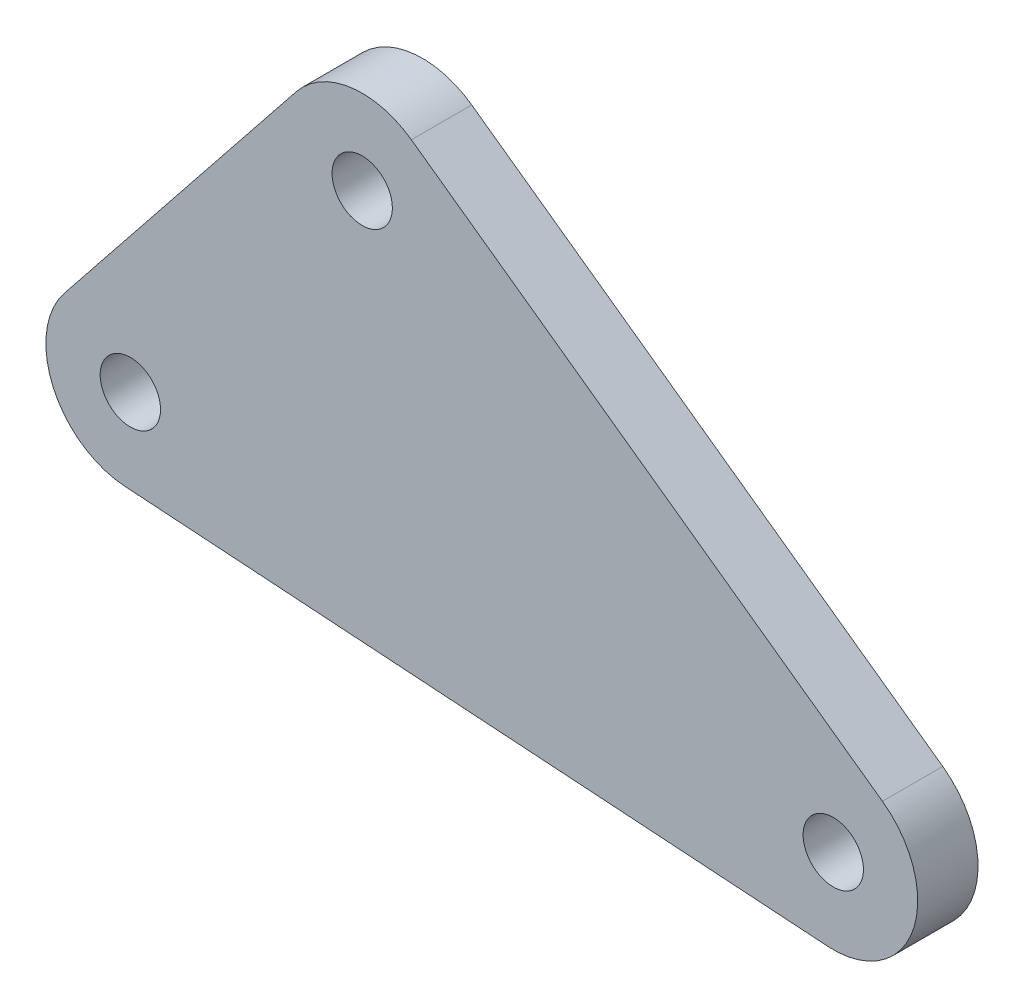
ISO-10303-21;
HEADER;
FILE_DESCRIPTION(('STEP AP214'),'2;1');
FILE_NAME('part.step','',(''),(''),'','','');
FILE_SCHEMA(('AUTOMOTIVE_DESIGN { 1 0 10303 214 1 1 1 1 }'));
ENDSEC;
DATA;
#1=APPLICATION_CONTEXT('core data for automotive mechanical design processes');
#2=APPLICATION_PROTOCOL_DEFINITION('international standard','automotive_design',2000,#1);
#3=PRODUCT_CONTEXT('',#1,'mechanical');
#4=PRODUCT('Part','Part','',(#3));
#5=PRODUCT_RELATED_PRODUCT_CATEGORY('part','',(#4));
#6=PRODUCT_DEFINITION_FORMATION('','',#4);
#7=PRODUCT_DEFINITION_CONTEXT('part definition',#1,'design');
#8=PRODUCT_DEFINITION('design','',#6,#7);
#9=PRODUCT_DEFINITION_SHAPE('','',#8);
#10=(LENGTH_UNIT() NAMED_UNIT(*) SI_UNIT(.MILLI.,.METRE.));
#11=(NAMED_UNIT(*) PLANE_ANGLE_UNIT() SI_UNIT($,.RADIAN.));
#12=(NAMED_UNIT(*) SI_UNIT($,.STERADIAN.) SOLID_ANGLE_UNIT());
#13=UNCERTAINTY_MEASURE_WITH_UNIT(LENGTH_MEASURE(1.E-05),#10,'distance_accuracy_value','');
#14=(GEOMETRIC_REPRESENTATION_CONTEXT(3) GLOBAL_UNCERTAINTY_ASSIGNED_CONTEXT((#13)) GLOBAL_UNIT_ASSIGNED_CONTEXT((#10,
#11,#12)) REPRESENTATION_CONTEXT('',''));
#15=CARTESIAN_POINT('',(0.,0.,0.));
#16=DIRECTION('',(0.,0.,1.));
#17=DIRECTION('',(1.,0.,0.));
#18=AXIS2_PLACEMENT_3D('',#15,#16,#17);
#19=CARTESIAN_POINT('',(0.,0.,6.35));
#20=DIRECTION('',(0.,0.,-1.));
#21=DIRECTION('',(-1.,0.,0.));
#22=AXIS2_PLACEMENT_3D('',#19,#20,#21);
#23=PLANE('',#22);
#24=DIRECTION('',(0.997779520334436,-0.0666035194354014,0.));
#25=VECTOR('',#24,1.);
#26=CARTESIAN_POINT('',(104.54447737393,-15.8883097994683,6.35));
#27=LINE('',#26,#25);
#28=CARTESIAN_POINT('',(-0.592105287780698,-8.87025993577314,6.35));
#29=VERTEX_POINT('',#28);
#30=CARTESIAN_POINT('',(73.3942439245381,-13.8089775054276,6.35));
#31=VERTEX_POINT('',#30);
#32=EDGE_CURVE('E124',#29,#31,#27,.T.);
#33=ORIENTED_EDGE('',*,*,#32,.T.);
#34=CARTESIAN_POINT('',(73.9863492123188,-4.93871756965445,6.35));
#35=DIRECTION('',(0.,0.,-1.));
#36=DIRECTION('',(-1.,0.,0.));
#37=AXIS2_PLACEMENT_3D('',#34,#35,#36);
#38=CIRCLE('',#37,8.89);
#39=CARTESIAN_POINT('',(79.1624719991504,2.28899665378038,6.35));
#40=VERTEX_POINT('',#39);
#41=EDGE_CURVE('E136',#31,#40,#38,.F.);
#42=ORIENTED_EDGE('',*,*,#41,.T.);
#43=DIRECTION('',(-0.813016223108531,0.582241033389385,0.));
#44=VECTOR('',#43,1.);
#45=CARTESIAN_POINT('',(22.7210333975556,42.7094957819869,6.35));
#46=LINE('',#45,#44);
#47=CARTESIAN_POINT('',(29.5806776328767,37.7969660750321,6.35));
#48=VERTEX_POINT('',#47);
#49=EDGE_CURVE('E113',#40,#48,#46,.T.);
#50=ORIENTED_EDGE('',*,*,#49,.T.);
#51=CARTESIAN_POINT('',(24.404554846045,30.5692518515972,6.35));
#52=DIRECTION('',(0.,0.,-1.));
#53=DIRECTION('',(-1.,0.,0.));
#54=AXIS2_PLACEMENT_3D('',#51,#52,#53);
#55=CIRCLE('',#54,8.89);
#56=CARTESIAN_POINT('',(17.4569976070457,36.1157415893347,6.35));
#57=VERTEX_POINT('',#56);
#58=EDGE_CURVE('E62',#48,#57,#55,.F.);
#59=ORIENTED_EDGE('',*,*,#58,.T.);
#60=DIRECTION('',(-0.623902107732003,-0.781502501574732,0.));
#61=VECTOR('',#60,1.);
#62=CARTESIAN_POINT('',(-17.5531186725038,-7.73808277479587,6.35));
#63=LINE('',#62,#61);
#64=CARTESIAN_POINT('',(-6.94755723899937,5.54648973773751,6.35));
#65=VERTEX_POINT('',#64);
#66=EDGE_CURVE('E126',#57,#65,#63,.T.);
#67=ORIENTED_EDGE('',*,*,#66,.T.);
#68=CARTESIAN_POINT('',(0.,0.,6.35));
#69=DIRECTION('',(0.,0.,-1.));
#70=DIRECTION('',(-1.,0.,0.));
#71=AXIS2_PLACEMENT_3D('',#68,#69,#70);
#72=CIRCLE('',#71,8.89);
#73=EDGE_CURVE('E140',#65,#29,#72,.F.);
#74=ORIENTED_EDGE('',*,*,#73,.T.);
#75=EDGE_LOOP('',(#33,#42,#50,#59,#67,#74));
#76=FACE_BOUND('',#75,.T.);
#77=CARTESIAN_POINT('',(24.404554846045,30.5692518515972,6.35));
#78=DIRECTION('',(0.,0.,1.));
#79=DIRECTION('',(1.,0.,0.));
#80=AXIS2_PLACEMENT_3D('',#77,#78,#79);
#81=CIRCLE('',#80,3.175);
#82=CARTESIAN_POINT('',(27.579554846045,30.5692518515972,6.35));
#83=VERTEX_POINT('',#82);
#84=EDGE_CURVE('E123',#83,#83,#81,.T.);
#85=ORIENTED_EDGE('',*,*,#84,.F.);
#86=EDGE_LOOP('',(#85));
#87=FACE_BOUND('',#86,.T.);
#88=CARTESIAN_POINT('',(0.,0.,6.35));
#89=DIRECTION('',(0.,0.,1.));
#90=DIRECTION('',(1.,0.,0.));
#91=AXIS2_PLACEMENT_3D('',#88,#89,#90);
#92=CIRCLE('',#91,3.175);
#93=CARTESIAN_POINT('',(3.175,0.,6.35));
#94=VERTEX_POINT('',#93);
#95=EDGE_CURVE('E168',#94,#94,#92,.T.);
#96=ORIENTED_EDGE('',*,*,#95,.F.);
#97=EDGE_LOOP('',(#96));
#98=FACE_BOUND('',#97,.T.);
#99=CARTESIAN_POINT('',(73.9863492123188,-4.93871756965445,6.35));
#100=DIRECTION('',(0.,0.,1.));
#101=DIRECTION('',(1.,0.,0.));
#102=AXIS2_PLACEMENT_3D('',#99,#100,#101);
#103=CIRCLE('',#102,3.17499999999997);
#104=CARTESIAN_POINT('',(77.1613492123188,-4.93871756965445,6.35));
#105=VERTEX_POINT('',#104);
#106=EDGE_CURVE('E169',#105,#105,#103,.T.);
#107=ORIENTED_EDGE('',*,*,#106,.F.);
#108=EDGE_LOOP('',(#107));
#109=FACE_BOUND('',#108,.T.);
#110=ADVANCED_FACE('F41',(#76,#87,#98,#109),#23,.F.);
#111=CARTESIAN_POINT('',(0.,0.,0.));
#112=DIRECTION('',(0.,0.,-1.));
#113=DIRECTION('',(-1.,0.,0.));
#114=AXIS2_PLACEMENT_3D('',#111,#112,#113);
#115=PLANE('',#114);
#116=CARTESIAN_POINT('',(0.,0.,0.));
#117=DIRECTION('',(0.,0.,1.));
#118=DIRECTION('',(1.,0.,0.));
#119=AXIS2_PLACEMENT_3D('',#116,#117,#118);
#120=CIRCLE('',#119,3.175);
#121=CARTESIAN_POINT('',(3.175,0.,0.));
#122=VERTEX_POINT('',#121);
#123=EDGE_CURVE('E171',#122,#122,#120,.T.);
#124=ORIENTED_EDGE('',*,*,#123,.T.);
#125=EDGE_LOOP('',(#124));
#126=FACE_BOUND('',#125,.T.);
#127=DIRECTION('',(-0.813016223108531,0.582241033389385,0.));
#128=VECTOR('',#127,1.);
#129=CARTESIAN_POINT('',(22.7210333975556,42.7094957819869,0.));
#130=LINE('',#129,#128);
#131=CARTESIAN_POINT('',(79.1624719991504,2.28899665378038,0.));
#132=VERTEX_POINT('',#131);
#133=CARTESIAN_POINT('',(29.5806776328767,37.7969660750321,0.));
#134=VERTEX_POINT('',#133);
#135=EDGE_CURVE('E111',#132,#134,#130,.T.);
#136=ORIENTED_EDGE('',*,*,#135,.F.);
#137=CARTESIAN_POINT('',(73.9863492123188,-4.93871756965445,0.));
#138=DIRECTION('',(0.,0.,-1.));
#139=DIRECTION('',(-1.,0.,0.));
#140=AXIS2_PLACEMENT_3D('',#137,#138,#139);
#141=CIRCLE('',#140,8.89);
#142=CARTESIAN_POINT('',(73.3942439245381,-13.8089775054276,0.));
#143=VERTEX_POINT('',#142);
#144=EDGE_CURVE('E91',#132,#143,#141,.T.);
#145=ORIENTED_EDGE('',*,*,#144,.T.);
#146=DIRECTION('',(0.997779520334436,-0.0666035194354014,0.));
#147=VECTOR('',#146,1.);
#148=CARTESIAN_POINT('',(104.54447737393,-15.8883097994683,0.));
#149=LINE('',#148,#147);
#150=CARTESIAN_POINT('',(-0.592105287780698,-8.87025993577314,0.));
#151=VERTEX_POINT('',#150);
#152=EDGE_CURVE('E122',#151,#143,#149,.T.);
#153=ORIENTED_EDGE('',*,*,#152,.F.);
#154=CARTESIAN_POINT('',(0.,0.,0.));
#155=DIRECTION('',(0.,0.,-1.));
#156=DIRECTION('',(-1.,0.,0.));
#157=AXIS2_PLACEMENT_3D('',#154,#155,#156);
#158=CIRCLE('',#157,8.89);
#159=CARTESIAN_POINT('',(-6.94755723899937,5.54648973773751,0.));
#160=VERTEX_POINT('',#159);
#161=EDGE_CURVE('E102',#151,#160,#158,.T.);
#162=ORIENTED_EDGE('',*,*,#161,.T.);
#163=DIRECTION('',(-0.623902107732003,-0.781502501574732,0.));
#164=VECTOR('',#163,1.);
#165=CARTESIAN_POINT('',(-17.5531186725038,-7.73808277479587,0.));
#166=LINE('',#165,#164);
#167=CARTESIAN_POINT('',(17.4569976070457,36.1157415893347,0.));
#168=VERTEX_POINT('',#167);
#169=EDGE_CURVE('E119',#168,#160,#166,.T.);
#170=ORIENTED_EDGE('',*,*,#169,.F.);
#171=CARTESIAN_POINT('',(24.404554846045,30.5692518515972,0.));
#172=DIRECTION('',(0.,0.,-1.));
#173=DIRECTION('',(-1.,0.,0.));
#174=AXIS2_PLACEMENT_3D('',#171,#172,#173);
#175=CIRCLE('',#174,8.89);
#176=EDGE_CURVE('E112',#168,#134,#175,.T.);
#177=ORIENTED_EDGE('',*,*,#176,.T.);
#178=EDGE_LOOP('',(#136,#145,#153,#162,#170,#177));
#179=FACE_BOUND('',#178,.T.);
#180=CARTESIAN_POINT('',(24.404554846045,30.5692518515972,0.));
#181=DIRECTION('',(0.,0.,1.));
#182=DIRECTION('',(1.,0.,0.));
#183=AXIS2_PLACEMENT_3D('',#180,#181,#182);
#184=CIRCLE('',#183,3.175);
#185=CARTESIAN_POINT('',(27.579554846045,30.5692518515972,0.));
#186=VERTEX_POINT('',#185);
#187=EDGE_CURVE('E151',#186,#186,#184,.T.);
#188=ORIENTED_EDGE('',*,*,#187,.T.);
#189=EDGE_LOOP('',(#188));
#190=FACE_BOUND('',#189,.T.);
#191=CARTESIAN_POINT('',(73.9863492123188,-4.93871756965445,0.));
#192=DIRECTION('',(0.,0.,1.));
#193=DIRECTION('',(1.,0.,0.));
#194=AXIS2_PLACEMENT_3D('',#191,#192,#193);
#195=CIRCLE('',#194,3.17499999999997);
#196=CARTESIAN_POINT('',(77.1613492123188,-4.93871756965445,0.));
#197=VERTEX_POINT('',#196);
#198=EDGE_CURVE('E175',#197,#197,#195,.T.);
#199=ORIENTED_EDGE('',*,*,#198,.T.);
#200=EDGE_LOOP('',(#199));
#201=FACE_BOUND('',#200,.T.);
#202=ADVANCED_FACE('F120',(#126,#179,#190,#201),#115,.T.);
#203=CARTESIAN_POINT('',(104.54447737393,-15.8883097994683,6.35));
#204=DIRECTION('',(0.0666035194354014,0.997779520334436,0.));
#205=DIRECTION('',(-0.997779520334437,0.0666035194354014,0.));
#206=AXIS2_PLACEMENT_3D('',#203,#204,#205);
#207=PLANE('',#206);
#208=ORIENTED_EDGE('',*,*,#152,.T.);
#209=DIRECTION('',(0.,0.,-1.));
#210=VECTOR('',#209,1.);
#211=CARTESIAN_POINT('',(73.3942439245381,-13.8089775054276,6.35));
#212=LINE('',#211,#210);
#213=EDGE_CURVE('E100',#143,#31,#212,.F.);
#214=ORIENTED_EDGE('',*,*,#213,.T.);
#215=ORIENTED_EDGE('',*,*,#32,.F.);
#216=DIRECTION('',(0.,0.,-1.));
#217=VECTOR('',#216,1.);
#218=CARTESIAN_POINT('',(-0.592105287780711,-8.87025993577314,6.35));
#219=LINE('',#218,#217);
#220=EDGE_CURVE('E104',#29,#151,#219,.T.);
#221=ORIENTED_EDGE('',*,*,#220,.T.);
#222=EDGE_LOOP('',(#208,#214,#215,#221));
#223=FACE_BOUND('',#222,.T.);
#224=ADVANCED_FACE('F148',(#223),#207,.F.);
#225=CARTESIAN_POINT('',(22.7210333975556,42.7094957819869,6.35));
#226=DIRECTION('',(-0.582241033389385,-0.813016223108531,0.));
#227=DIRECTION('',(0.813016223108531,-0.582241033389385,0.));
#228=AXIS2_PLACEMENT_3D('',#225,#226,#227);
#229=PLANE('',#228);
#230=ORIENTED_EDGE('',*,*,#49,.F.);
#231=DIRECTION('',(0.,0.,-1.));
#232=VECTOR('',#231,1.);
#233=CARTESIAN_POINT('',(79.1624719991504,2.28899665378038,6.35));
#234=LINE('',#233,#232);
#235=EDGE_CURVE('E96',#40,#132,#234,.T.);
#236=ORIENTED_EDGE('',*,*,#235,.T.);
#237=ORIENTED_EDGE('',*,*,#135,.T.);
#238=DIRECTION('',(0.,0.,-1.));
#239=VECTOR('',#238,1.);
#240=CARTESIAN_POINT('',(29.5806776328767,37.7969660750321,6.35));
#241=LINE('',#240,#239);
#242=EDGE_CURVE('E114',#134,#48,#241,.F.);
#243=ORIENTED_EDGE('',*,*,#242,.T.);
#244=EDGE_LOOP('',(#230,#236,#237,#243));
#245=FACE_BOUND('',#244,.T.);
#246=ADVANCED_FACE('F109',(#245),#229,.F.);
#247=CARTESIAN_POINT('',(-17.5531186725038,-7.73808277479587,6.35));
#248=DIRECTION('',(0.781502501574732,-0.623902107732003,0.));
#249=DIRECTION('',(0.623902107732003,0.781502501574732,0.));
#250=AXIS2_PLACEMENT_3D('',#247,#248,#249);
#251=PLANE('',#250);
#252=ORIENTED_EDGE('',*,*,#169,.T.);
#253=DIRECTION('',(0.,0.,-1.));
#254=VECTOR('',#253,1.);
#255=CARTESIAN_POINT('',(-6.94755723899937,5.54648973773751,6.35));
#256=LINE('',#255,#254);
#257=EDGE_CURVE('E11',#160,#65,#256,.F.);
#258=ORIENTED_EDGE('',*,*,#257,.T.);
#259=ORIENTED_EDGE('',*,*,#66,.F.);
#260=DIRECTION('',(0.,0.,-1.));
#261=VECTOR('',#260,1.);
#262=CARTESIAN_POINT('',(17.4569976070457,36.1157415893347,6.35));
#263=LINE('',#262,#261);
#264=EDGE_CURVE('E47',#57,#168,#263,.T.);
#265=ORIENTED_EDGE('',*,*,#264,.T.);
#266=EDGE_LOOP('',(#252,#258,#259,#265));
#267=FACE_BOUND('',#266,.T.);
#268=ADVANCED_FACE('F145',(#267),#251,.F.);
#269=CARTESIAN_POINT('',(24.404554846045,30.5692518515972,6.35));
#270=DIRECTION('',(0.,0.,-1.));
#271=DIRECTION('',(-1.,0.,0.));
#272=AXIS2_PLACEMENT_3D('',#269,#270,#271);
#273=CYLINDRICAL_SURFACE('',#272,3.175);
#274=ORIENTED_EDGE('',*,*,#84,.T.);
#275=EDGE_LOOP('',(#274));
#276=FACE_BOUND('',#275,.T.);
#277=ORIENTED_EDGE('',*,*,#187,.F.);
#278=EDGE_LOOP('',(#277));
#279=FACE_BOUND('',#278,.T.);
#280=ADVANCED_FACE('F183',(#276,#279),#273,.F.);
#281=CARTESIAN_POINT('',(0.,0.,6.35));
#282=DIRECTION('',(0.,0.,-1.));
#283=DIRECTION('',(-1.,0.,0.));
#284=AXIS2_PLACEMENT_3D('',#281,#282,#283);
#285=CYLINDRICAL_SURFACE('',#284,3.175);
#286=ORIENTED_EDGE('',*,*,#95,.T.);
#287=EDGE_LOOP('',(#286));
#288=FACE_BOUND('',#287,.T.);
#289=ORIENTED_EDGE('',*,*,#123,.F.);
#290=EDGE_LOOP('',(#289));
#291=FACE_BOUND('',#290,.T.);
#292=ADVANCED_FACE('F187',(#288,#291),#285,.F.);
#293=CARTESIAN_POINT('',(73.9863492123188,-4.93871756965445,6.35));
#294=DIRECTION('',(0.,0.,-1.));
#295=DIRECTION('',(-1.,0.,0.));
#296=AXIS2_PLACEMENT_3D('',#293,#294,#295);
#297=CYLINDRICAL_SURFACE('',#296,3.17499999999997);
#298=ORIENTED_EDGE('',*,*,#106,.T.);
#299=EDGE_LOOP('',(#298));
#300=FACE_BOUND('',#299,.T.);
#301=ORIENTED_EDGE('',*,*,#198,.F.);
#302=EDGE_LOOP('',(#301));
#303=FACE_BOUND('',#302,.T.);
#304=ADVANCED_FACE('F192',(#300,#303),#297,.F.);
#305=CARTESIAN_POINT('',(73.9863492123188,-4.93871756965445,6.35));
#306=DIRECTION('',(0.,0.,-1.));
#307=DIRECTION('',(-1.,0.,0.));
#308=AXIS2_PLACEMENT_3D('',#305,#306,#307);
#309=CYLINDRICAL_SURFACE('',#308,8.89);
#310=ORIENTED_EDGE('',*,*,#41,.F.);
#311=ORIENTED_EDGE('',*,*,#213,.F.);
#312=ORIENTED_EDGE('',*,*,#144,.F.);
#313=ORIENTED_EDGE('',*,*,#235,.F.);
#314=EDGE_LOOP('',(#310,#311,#312,#313));
#315=FACE_BOUND('',#314,.T.);
#316=ADVANCED_FACE('F97',(#315),#309,.T.);
#317=CARTESIAN_POINT('',(0.,0.,6.35));
#318=DIRECTION('',(0.,0.,-1.));
#319=DIRECTION('',(-1.,0.,0.));
#320=AXIS2_PLACEMENT_3D('',#317,#318,#319);
#321=CYLINDRICAL_SURFACE('',#320,8.89);
#322=ORIENTED_EDGE('',*,*,#73,.F.);
#323=ORIENTED_EDGE('',*,*,#257,.F.);
#324=ORIENTED_EDGE('',*,*,#161,.F.);
#325=ORIENTED_EDGE('',*,*,#220,.F.);
#326=EDGE_LOOP('',(#322,#323,#324,#325));
#327=FACE_BOUND('',#326,.T.);
#328=ADVANCED_FACE('F150',(#327),#321,.T.);
#329=CARTESIAN_POINT('',(24.404554846045,30.5692518515972,6.35));
#330=DIRECTION('',(0.,0.,-1.));
#331=DIRECTION('',(-1.,0.,0.));
#332=AXIS2_PLACEMENT_3D('',#329,#330,#331);
#333=CYLINDRICAL_SURFACE('',#332,8.89);
#334=ORIENTED_EDGE('',*,*,#58,.F.);
#335=ORIENTED_EDGE('',*,*,#242,.F.);
#336=ORIENTED_EDGE('',*,*,#176,.F.);
#337=ORIENTED_EDGE('',*,*,#264,.F.);
#338=EDGE_LOOP('',(#334,#335,#336,#337));
#339=FACE_BOUND('',#338,.T.);
#340=ADVANCED_FACE('F43',(#339),#333,.T.);
#341=CLOSED_SHELL('',(#110,#202,#224,#246,#268,#280,#292,#304,#316,#328,#340));
#342=MANIFOLD_SOLID_BREP('B2',#341);
#343=ADVANCED_BREP_SHAPE_REPRESENTATION('',(#18,#342),#14);
#344=SHAPE_DEFINITION_REPRESENTATION(#9,#343);
ENDSEC;
END-ISO-10303-21;
